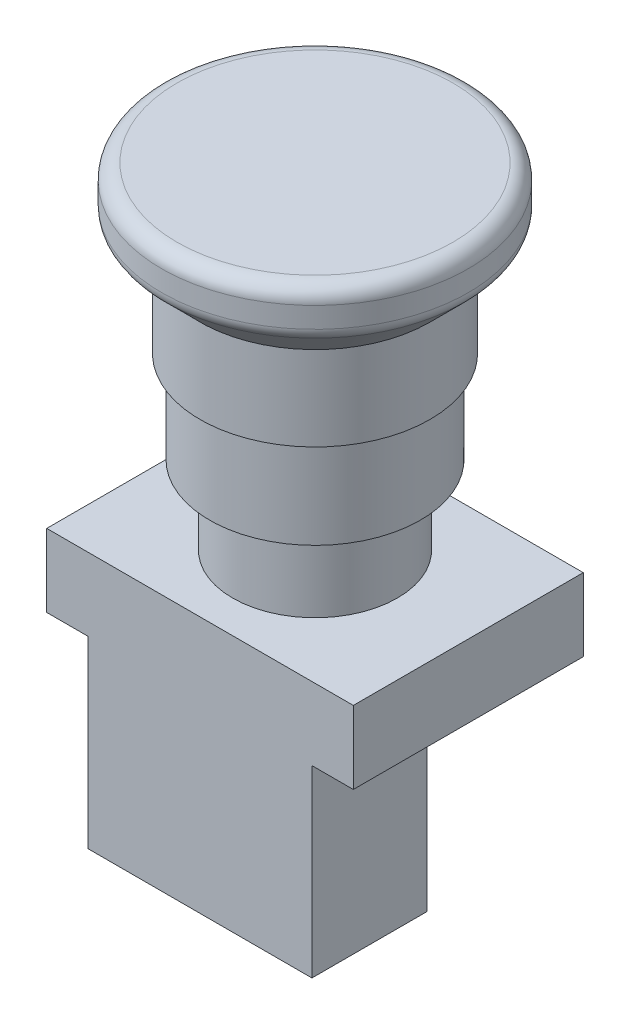
ISO-10303-21;
HEADER;
FILE_DESCRIPTION(('STEP AP214'),'2;1');
FILE_NAME('part.step','',(''),(''),'','','');
FILE_SCHEMA(('AUTOMOTIVE_DESIGN { 1 0 10303 214 1 1 1 1 }'));
ENDSEC;
DATA;
#1=APPLICATION_CONTEXT('core data for automotive mechanical design processes');
#2=APPLICATION_PROTOCOL_DEFINITION('international standard','automotive_design',2000,#1);
#3=PRODUCT_CONTEXT('',#1,'mechanical');
#4=PRODUCT('Part','Part','',(#3));
#5=PRODUCT_RELATED_PRODUCT_CATEGORY('part','',(#4));
#6=PRODUCT_DEFINITION_FORMATION('','',#4);
#7=PRODUCT_DEFINITION_CONTEXT('part definition',#1,'design');
#8=PRODUCT_DEFINITION('design','',#6,#7);
#9=PRODUCT_DEFINITION_SHAPE('','',#8);
#10=(LENGTH_UNIT() NAMED_UNIT(*) SI_UNIT(.MILLI.,.METRE.));
#11=(NAMED_UNIT(*) PLANE_ANGLE_UNIT() SI_UNIT($,.RADIAN.));
#12=(NAMED_UNIT(*) SI_UNIT($,.STERADIAN.) SOLID_ANGLE_UNIT());
#13=UNCERTAINTY_MEASURE_WITH_UNIT(LENGTH_MEASURE(1.E-05),#10,'distance_accuracy_value','');
#14=(GEOMETRIC_REPRESENTATION_CONTEXT(3) GLOBAL_UNCERTAINTY_ASSIGNED_CONTEXT((#13)) GLOBAL_UNIT_ASSIGNED_CONTEXT((#10,
#11,#12)) REPRESENTATION_CONTEXT('',''));
#15=CARTESIAN_POINT('',(0.,0.,0.));
#16=DIRECTION('',(0.,0.,1.));
#17=DIRECTION('',(1.,0.,0.));
#18=AXIS2_PLACEMENT_3D('',#15,#16,#17);
#19=CARTESIAN_POINT('',(0.,0.,0.));
#20=DIRECTION('',(0.,-1.,0.));
#21=DIRECTION('',(0.,0.,-1.));
#22=AXIS2_PLACEMENT_3D('',#19,#20,#21);
#23=CYLINDRICAL_SURFACE('',#22,13.75);
#24=CARTESIAN_POINT('',(0.,12.,0.));
#25=DIRECTION('',(0.,-1.,0.));
#26=DIRECTION('',(0.,0.,-1.));
#27=AXIS2_PLACEMENT_3D('',#24,#25,#26);
#28=CIRCLE('',#27,13.75);
#29=CARTESIAN_POINT('',(0.,12.,-13.75));
#30=VERTEX_POINT('',#29);
#31=EDGE_CURVE('E218',#30,#30,#28,.T.);
#32=ORIENTED_EDGE('',*,*,#31,.T.);
#33=EDGE_LOOP('',(#32));
#34=FACE_BOUND('',#33,.T.);
#35=CARTESIAN_POINT('',(0.,0.,0.));
#36=DIRECTION('',(0.,-1.,0.));
#37=DIRECTION('',(0.,0.,-1.));
#38=AXIS2_PLACEMENT_3D('',#35,#36,#37);
#39=CIRCLE('',#38,13.75);
#40=CARTESIAN_POINT('',(0.,0.,-13.75));
#41=VERTEX_POINT('',#40);
#42=EDGE_CURVE('E55',#41,#41,#39,.T.);
#43=ORIENTED_EDGE('',*,*,#42,.F.);
#44=EDGE_LOOP('',(#43));
#45=FACE_BOUND('',#44,.T.);
#46=ADVANCED_FACE('F51',(#34,#45),#23,.T.);
#47=CARTESIAN_POINT('',(0.,0.,0.));
#48=DIRECTION('',(0.,-1.,0.));
#49=DIRECTION('',(0.,0.,-1.));
#50=AXIS2_PLACEMENT_3D('',#47,#48,#49);
#51=PLANE('',#50);
#52=CARTESIAN_POINT('',(0.,0.,0.));
#53=DIRECTION('',(0.,-1.,0.));
#54=DIRECTION('',(0.,0.,-1.));
#55=AXIS2_PLACEMENT_3D('',#52,#53,#54);
#56=CIRCLE('',#55,10.75);
#57=CARTESIAN_POINT('',(0.,0.,10.75));
#58=VERTEX_POINT('',#57);
#59=EDGE_CURVE('E11',#58,#58,#56,.T.);
#60=ORIENTED_EDGE('',*,*,#59,.F.);
#61=EDGE_LOOP('',(#60));
#62=FACE_BOUND('',#61,.T.);
#63=ORIENTED_EDGE('',*,*,#42,.T.);
#64=EDGE_LOOP('',(#63));
#65=FACE_BOUND('',#64,.T.);
#66=ADVANCED_FACE('F53',(#62,#65),#51,.T.);
#67=CARTESIAN_POINT('',(0.,12.,0.));
#68=DIRECTION('',(0.,1.,0.));
#69=DIRECTION('',(-1.,0.,0.));
#70=AXIS2_PLACEMENT_3D('',#67,#68,#69);
#71=PLANE('',#70);
#72=ORIENTED_EDGE('',*,*,#31,.F.);
#73=EDGE_LOOP('',(#72));
#74=FACE_BOUND('',#73,.T.);
#75=CARTESIAN_POINT('',(0.,12.,0.));
#76=DIRECTION('',(0.,1.,0.));
#77=DIRECTION('',(-1.,0.,0.));
#78=AXIS2_PLACEMENT_3D('',#75,#76,#77);
#79=CIRCLE('',#78,15.);
#80=CARTESIAN_POINT('',(-15.,12.,0.));
#81=VERTEX_POINT('',#80);
#82=EDGE_CURVE('E215',#81,#81,#79,.T.);
#83=ORIENTED_EDGE('',*,*,#82,.F.);
#84=EDGE_LOOP('',(#83));
#85=FACE_BOUND('',#84,.T.);
#86=ADVANCED_FACE('F229',(#74,#85),#71,.F.);
#87=CARTESIAN_POINT('',(0.,28.,0.));
#88=DIRECTION('',(0.,1.,0.));
#89=DIRECTION('',(-1.,0.,0.));
#90=AXIS2_PLACEMENT_3D('',#87,#88,#89);
#91=CYLINDRICAL_SURFACE('',#90,15.);
#92=CARTESIAN_POINT('',(0.,23.,0.));
#93=DIRECTION('',(0.,1.,0.));
#94=DIRECTION('',(-1.,0.,0.));
#95=AXIS2_PLACEMENT_3D('',#92,#93,#94);
#96=CIRCLE('',#95,15.);
#97=CARTESIAN_POINT('',(-15.,23.,0.));
#98=VERTEX_POINT('',#97);
#99=EDGE_CURVE('E211',#98,#98,#96,.T.);
#100=ORIENTED_EDGE('',*,*,#99,.F.);
#101=EDGE_LOOP('',(#100));
#102=FACE_BOUND('',#101,.T.);
#103=ORIENTED_EDGE('',*,*,#82,.T.);
#104=EDGE_LOOP('',(#103));
#105=FACE_BOUND('',#104,.T.);
#106=ADVANCED_FACE('F237',(#102,#105),#91,.T.);
#107=CARTESIAN_POINT('',(0.,23.,0.));
#108=DIRECTION('',(0.,1.,0.));
#109=DIRECTION('',(-1.,0.,0.));
#110=AXIS2_PLACEMENT_3D('',#107,#108,#109);
#111=CONICAL_SURFACE('',#110,15.,0.785398163397448);
#112=CARTESIAN_POINT('',(0.,27.4142135623731,0.));
#113=DIRECTION('',(0.,1.,0.));
#114=DIRECTION('',(-1.,0.,0.));
#115=AXIS2_PLACEMENT_3D('',#112,#113,#114);
#116=CIRCLE('',#115,19.4142135623731);
#117=CARTESIAN_POINT('',(-19.4142135623731,27.4142135623731,0.));
#118=VERTEX_POINT('',#117);
#119=EDGE_CURVE('E207',#118,#118,#116,.T.);
#120=ORIENTED_EDGE('',*,*,#119,.F.);
#121=EDGE_LOOP('',(#120));
#122=FACE_BOUND('',#121,.T.);
#123=ORIENTED_EDGE('',*,*,#99,.T.);
#124=EDGE_LOOP('',(#123));
#125=FACE_BOUND('',#124,.T.);
#126=ADVANCED_FACE('F242',(#122,#125),#111,.T.);
#127=CARTESIAN_POINT('',(0.,28.8284271247462,0.));
#128=DIRECTION('',(0.,1.,0.));
#129=DIRECTION('',(-1.,0.,0.));
#130=AXIS2_PLACEMENT_3D('',#127,#128,#129);
#131=TOROIDAL_SURFACE('',#130,18.,2.);
#132=CARTESIAN_POINT('',(0.,28.8284271247462,0.));
#133=DIRECTION('',(0.,1.,0.));
#134=DIRECTION('',(-1.,0.,0.));
#135=AXIS2_PLACEMENT_3D('',#132,#133,#134);
#136=CIRCLE('',#135,20.);
#137=CARTESIAN_POINT('',(-20.,28.8284271247462,0.));
#138=VERTEX_POINT('',#137);
#139=EDGE_CURVE('E203',#138,#138,#136,.T.);
#140=ORIENTED_EDGE('',*,*,#139,.F.);
#141=EDGE_LOOP('',(#140));
#142=FACE_BOUND('',#141,.T.);
#143=ORIENTED_EDGE('',*,*,#119,.T.);
#144=EDGE_LOOP('',(#143));
#145=FACE_BOUND('',#144,.T.);
#146=ADVANCED_FACE('F249',(#142,#145),#131,.T.);
#147=CARTESIAN_POINT('',(0.,28.,0.));
#148=DIRECTION('',(0.,1.,0.));
#149=DIRECTION('',(-1.,0.,0.));
#150=AXIS2_PLACEMENT_3D('',#147,#148,#149);
#151=CYLINDRICAL_SURFACE('',#150,20.);
#152=CARTESIAN_POINT('',(0.,31.5281435790811,0.));
#153=DIRECTION('',(0.,1.,0.));
#154=DIRECTION('',(-1.,0.,0.));
#155=AXIS2_PLACEMENT_3D('',#152,#153,#154);
#156=CIRCLE('',#155,20.);
#157=CARTESIAN_POINT('',(-20.,31.5281435790811,0.));
#158=VERTEX_POINT('',#157);
#159=EDGE_CURVE('E199',#158,#158,#156,.T.);
#160=ORIENTED_EDGE('',*,*,#159,.F.);
#161=EDGE_LOOP('',(#160));
#162=FACE_BOUND('',#161,.T.);
#163=ORIENTED_EDGE('',*,*,#139,.T.);
#164=EDGE_LOOP('',(#163));
#165=FACE_BOUND('',#164,.T.);
#166=ADVANCED_FACE('F253',(#162,#165),#151,.T.);
#167=CARTESIAN_POINT('',(0.,31.5281435790811,0.));
#168=DIRECTION('',(0.,1.,0.));
#169=DIRECTION('',(-1.,0.,0.));
#170=AXIS2_PLACEMENT_3D('',#167,#168,#169);
#171=TOROIDAL_SURFACE('',#170,18.,2.);
#172=CARTESIAN_POINT('',(0.,33.5281435790811,0.));
#173=DIRECTION('',(0.,1.,0.));
#174=DIRECTION('',(-1.,0.,0.));
#175=AXIS2_PLACEMENT_3D('',#172,#173,#174);
#176=CIRCLE('',#175,18.);
#177=CARTESIAN_POINT('',(-18.,33.5281435790811,0.));
#178=VERTEX_POINT('',#177);
#179=EDGE_CURVE('E194',#178,#178,#176,.T.);
#180=ORIENTED_EDGE('',*,*,#179,.F.);
#181=EDGE_LOOP('',(#180));
#182=FACE_BOUND('',#181,.T.);
#183=ORIENTED_EDGE('',*,*,#159,.T.);
#184=EDGE_LOOP('',(#183));
#185=FACE_BOUND('',#184,.T.);
#186=ADVANCED_FACE('F257',(#182,#185),#171,.T.);
#187=CARTESIAN_POINT('',(0.,33.5281435790811,0.));
#188=DIRECTION('',(0.,-1.,0.));
#189=DIRECTION('',(1.,0.,0.));
#190=AXIS2_PLACEMENT_3D('',#187,#188,#189);
#191=PLANE('',#190);
#192=ORIENTED_EDGE('',*,*,#179,.T.);
#193=EDGE_LOOP('',(#192));
#194=FACE_BOUND('',#193,.T.);
#195=ADVANCED_FACE('F261',(#194),#191,.F.);
#196=CARTESIAN_POINT('',(0.,-10.3,0.));
#197=DIRECTION('',(0.,1.,0.));
#198=DIRECTION('',(0.,0.,1.));
#199=AXIS2_PLACEMENT_3D('',#196,#197,#198);
#200=CYLINDRICAL_SURFACE('',#199,10.75);
#201=CARTESIAN_POINT('',(0.,-10.3,0.));
#202=DIRECTION('',(0.,-1.,0.));
#203=DIRECTION('',(0.,0.,-1.));
#204=AXIS2_PLACEMENT_3D('',#201,#202,#203);
#205=CIRCLE('',#204,10.75);
#206=CARTESIAN_POINT('',(0.,-10.3,10.75));
#207=VERTEX_POINT('',#206);
#208=EDGE_CURVE('E191',#207,#207,#205,.T.);
#209=CARTESIAN_POINT('',(0.,-10.3,10.75));
#210=CARTESIAN_POINT('',(0.,-10.1927083333333,10.75));
#211=CARTESIAN_POINT('',(0.,-10.0854166666667,10.75));
#212=CARTESIAN_POINT('',(0.,-9.87083333333333,10.75));
#213=CARTESIAN_POINT('',(0.,-9.76354166666667,10.75));
#214=CARTESIAN_POINT('',(0.,-9.54895833333333,10.75));
#215=CARTESIAN_POINT('',(0.,-9.44166666666667,10.75));
#216=CARTESIAN_POINT('',(0.,-9.22708333333333,10.75));
#217=CARTESIAN_POINT('',(0.,-9.11979166666667,10.75));
#218=CARTESIAN_POINT('',(0.,-8.90520833333333,10.75));
#219=CARTESIAN_POINT('',(0.,-8.79791666666667,10.75));
#220=CARTESIAN_POINT('',(0.,-8.58333333333333,10.75));
#221=CARTESIAN_POINT('',(0.,-8.47604166666667,10.75));
#222=CARTESIAN_POINT('',(0.,-8.26145833333333,10.75));
#223=CARTESIAN_POINT('',(0.,-8.15416666666667,10.75));
#224=CARTESIAN_POINT('',(0.,-7.93958333333333,10.75));
#225=CARTESIAN_POINT('',(0.,-7.83229166666667,10.75));
#226=CARTESIAN_POINT('',(0.,-7.61770833333333,10.75));
#227=CARTESIAN_POINT('',(0.,-7.51041666666667,10.75));
#228=CARTESIAN_POINT('',(0.,-7.29583333333333,10.75));
#229=CARTESIAN_POINT('',(0.,-7.18854166666666,10.75));
#230=CARTESIAN_POINT('',(0.,-6.97395833333333,10.75));
#231=CARTESIAN_POINT('',(0.,-6.86666666666667,10.75));
#232=CARTESIAN_POINT('',(0.,-6.65208333333333,10.75));
#233=CARTESIAN_POINT('',(0.,-6.54479166666667,10.75));
#234=CARTESIAN_POINT('',(0.,-6.33020833333333,10.75));
#235=CARTESIAN_POINT('',(0.,-6.22291666666667,10.75));
#236=CARTESIAN_POINT('',(0.,-6.00833333333333,10.75));
#237=CARTESIAN_POINT('',(0.,-5.90104166666667,10.75));
#238=CARTESIAN_POINT('',(0.,-5.68645833333333,10.75));
#239=CARTESIAN_POINT('',(0.,-5.57916666666667,10.75));
#240=CARTESIAN_POINT('',(0.,-5.36458333333333,10.75));
#241=CARTESIAN_POINT('',(0.,-5.25729166666667,10.75));
#242=CARTESIAN_POINT('',(0.,-5.04270833333333,10.75));
#243=CARTESIAN_POINT('',(0.,-4.93541666666667,10.75));
#244=CARTESIAN_POINT('',(0.,-4.72083333333333,10.75));
#245=CARTESIAN_POINT('',(0.,-4.61354166666666,10.75));
#246=CARTESIAN_POINT('',(0.,-4.39895833333333,10.75));
#247=CARTESIAN_POINT('',(0.,-4.29166666666667,10.75));
#248=CARTESIAN_POINT('',(0.,-4.07708333333333,10.75));
#249=CARTESIAN_POINT('',(0.,-3.96979166666666,10.75));
#250=CARTESIAN_POINT('',(0.,-3.75520833333333,10.75));
#251=CARTESIAN_POINT('',(0.,-3.64791666666666,10.75));
#252=CARTESIAN_POINT('',(0.,-3.43333333333333,10.75));
#253=CARTESIAN_POINT('',(0.,-3.32604166666666,10.75));
#254=CARTESIAN_POINT('',(0.,-3.11145833333333,10.75));
#255=CARTESIAN_POINT('',(0.,-3.00416666666666,10.75));
#256=CARTESIAN_POINT('',(0.,-2.78958333333333,10.75));
#257=CARTESIAN_POINT('',(0.,-2.68229166666666,10.75));
#258=CARTESIAN_POINT('',(0.,-2.46770833333333,10.75));
#259=CARTESIAN_POINT('',(0.,-2.36041666666667,10.75));
#260=CARTESIAN_POINT('',(0.,-2.14583333333333,10.75));
#261=CARTESIAN_POINT('',(0.,-2.03854166666667,10.75));
#262=CARTESIAN_POINT('',(0.,-1.82395833333333,10.75));
#263=CARTESIAN_POINT('',(0.,-1.71666666666667,10.75));
#264=CARTESIAN_POINT('',(0.,-1.50208333333333,10.75));
#265=CARTESIAN_POINT('',(0.,-1.39479166666667,10.75));
#266=CARTESIAN_POINT('',(0.,-1.18020833333333,10.75));
#267=CARTESIAN_POINT('',(0.,-1.07291666666667,10.75));
#268=CARTESIAN_POINT('',(0.,-0.858333333333333,10.75));
#269=CARTESIAN_POINT('',(0.,-0.751041666666665,10.75));
#270=CARTESIAN_POINT('',(0.,-0.536458333333331,10.75));
#271=CARTESIAN_POINT('',(0.,-0.429166666666664,10.75));
#272=CARTESIAN_POINT('',(0.,-0.214583333333331,10.75));
#273=CARTESIAN_POINT('',(0.,-0.107291666666665,10.75));
#274=CARTESIAN_POINT('',(0.,0.,10.75));
#275=B_SPLINE_CURVE_WITH_KNOTS('',3,(#209,#210,#211,#212,#213,#214,#215,#216,#217,#218,#219,
#220,#221,#222,#223,#224,#225,#226,#227,#228,#229,#230,#231,#232,#233,#234,#235,#236,#237,#238,
#239,#240,#241,#242,#243,#244,#245,#246,#247,#248,#249,#250,#251,#252,#253,#254,#255,#256,#257,
#258,#259,#260,#261,#262,#263,#264,#265,#266,#267,#268,#269,#270,#271,#272,#273,#274),
.UNSPECIFIED.,.F.,.F.,(4,2,2,2,2,2,2,2,2,2,2,2,2,2,2,2,2,2,2,2,2,2,2,2,2,2,2,2,2,2,2,2,4),(0.,
0.321875000000001,0.64375,0.965625000000001,1.2875,1.609375,1.93125,2.253125,2.575,2.896875,
3.21875,3.540625,3.8625,4.184375,4.50625,4.828125,5.15,5.471875,5.79375,6.115625,6.4375,
6.759375,7.08125,7.403125,7.725,8.046875,8.36875,8.690625,9.0125,9.334375,9.65625,9.978125,
10.3),.UNSPECIFIED.);
#276=EDGE_CURVE('BSEAM265',#207,#58,#275,.T.);
#277=ORIENTED_EDGE('',*,*,#208,.F.);
#278=ORIENTED_EDGE('',*,*,#59,.T.);
#279=ORIENTED_EDGE('',*,*,#276,.T.);
#280=ORIENTED_EDGE('',*,*,#276,.F.);
#281=EDGE_LOOP('',(#277,#279,#278,#280));
#282=FACE_BOUND('',#281,.T.);
#283=ADVANCED_FACE('F265',(#282),#200,.T.);
#284=CARTESIAN_POINT('',(20.,-19.8,15.));
#285=DIRECTION('',(-1.,0.,0.));
#286=DIRECTION('',(0.,0.,1.));
#287=AXIS2_PLACEMENT_3D('',#284,#285,#286);
#288=PLANE('',#287);
#289=DIRECTION('',(0.,0.,1.));
#290=VECTOR('',#289,1.);
#291=CARTESIAN_POINT('',(20.,-10.3,15.));
#292=LINE('',#291,#290);
#293=CARTESIAN_POINT('',(20.,-10.3,-15.));
#294=VERTEX_POINT('',#293);
#295=CARTESIAN_POINT('',(20.,-10.3,15.));
#296=VERTEX_POINT('',#295);
#297=EDGE_CURVE('E142',#294,#296,#292,.T.);
#298=ORIENTED_EDGE('',*,*,#297,.T.);
#299=DIRECTION('',(0.,1.,0.));
#300=VECTOR('',#299,1.);
#301=CARTESIAN_POINT('',(20.,-19.8,15.));
#302=LINE('',#301,#300);
#303=CARTESIAN_POINT('',(20.,-19.8,15.));
#304=VERTEX_POINT('',#303);
#305=EDGE_CURVE('E187',#304,#296,#302,.T.);
#306=ORIENTED_EDGE('',*,*,#305,.F.);
#307=DIRECTION('',(0.,0.,1.));
#308=VECTOR('',#307,1.);
#309=CARTESIAN_POINT('',(20.,-19.8,15.));
#310=LINE('',#309,#308);
#311=CARTESIAN_POINT('',(20.,-19.8,-15.));
#312=VERTEX_POINT('',#311);
#313=EDGE_CURVE('E153',#312,#304,#310,.T.);
#314=ORIENTED_EDGE('',*,*,#313,.F.);
#315=DIRECTION('',(0.,1.,0.));
#316=VECTOR('',#315,1.);
#317=CARTESIAN_POINT('',(20.,-19.8,-15.));
#318=LINE('',#317,#316);
#319=EDGE_CURVE('E167',#312,#294,#318,.T.);
#320=ORIENTED_EDGE('',*,*,#319,.T.);
#321=EDGE_LOOP('',(#298,#306,#314,#320));
#322=FACE_BOUND('',#321,.T.);
#323=ADVANCED_FACE('F269',(#322),#288,.F.);
#324=CARTESIAN_POINT('',(-20.,-19.8,15.));
#325=DIRECTION('',(0.,0.,-1.));
#326=DIRECTION('',(-1.,0.,0.));
#327=AXIS2_PLACEMENT_3D('',#324,#325,#326);
#328=PLANE('',#327);
#329=DIRECTION('',(-1.,0.,0.));
#330=VECTOR('',#329,1.);
#331=CARTESIAN_POINT('',(-20.,-10.3,15.));
#332=LINE('',#331,#330);
#333=CARTESIAN_POINT('',(-20.,-10.3,15.));
#334=VERTEX_POINT('',#333);
#335=EDGE_CURVE('E147',#296,#334,#332,.T.);
#336=ORIENTED_EDGE('',*,*,#335,.T.);
#337=DIRECTION('',(0.,1.,0.));
#338=VECTOR('',#337,1.);
#339=CARTESIAN_POINT('',(-20.,-19.8,15.));
#340=LINE('',#339,#338);
#341=CARTESIAN_POINT('',(-20.,-19.8,15.));
#342=VERTEX_POINT('',#341);
#343=EDGE_CURVE('E183',#342,#334,#340,.T.);
#344=ORIENTED_EDGE('',*,*,#343,.F.);
#345=DIRECTION('',(-1.,0.,0.));
#346=VECTOR('',#345,1.);
#347=CARTESIAN_POINT('',(-20.,-19.8,15.));
#348=LINE('',#347,#346);
#349=CARTESIAN_POINT('',(-14.6,-19.8,15.));
#350=VERTEX_POINT('',#349);
#351=EDGE_CURVE('E157',#350,#342,#348,.T.);
#352=ORIENTED_EDGE('',*,*,#351,.F.);
#353=DIRECTION('',(0.,1.,0.));
#354=VECTOR('',#353,1.);
#355=CARTESIAN_POINT('',(-14.6,-43.8,15.));
#356=LINE('',#355,#354);
#357=CARTESIAN_POINT('',(-14.6,-43.8,15.));
#358=VERTEX_POINT('',#357);
#359=EDGE_CURVE('E123',#358,#350,#356,.T.);
#360=ORIENTED_EDGE('',*,*,#359,.F.);
#361=DIRECTION('',(-1.,0.,0.));
#362=VECTOR('',#361,1.);
#363=CARTESIAN_POINT('',(-14.6,-43.8,15.));
#364=LINE('',#363,#362);
#365=CARTESIAN_POINT('',(14.6,-43.8,15.));
#366=VERTEX_POINT('',#365);
#367=EDGE_CURVE('E117',#366,#358,#364,.T.);
#368=ORIENTED_EDGE('',*,*,#367,.F.);
#369=DIRECTION('',(0.,1.,0.));
#370=VECTOR('',#369,1.);
#371=CARTESIAN_POINT('',(14.6,-43.8,15.));
#372=LINE('',#371,#370);
#373=CARTESIAN_POINT('',(14.6,-19.8,15.));
#374=VERTEX_POINT('',#373);
#375=EDGE_CURVE('E121',#366,#374,#372,.T.);
#376=ORIENTED_EDGE('',*,*,#375,.T.);
#377=EDGE_CURVE('E159',#304,#374,#348,.T.);
#378=ORIENTED_EDGE('',*,*,#377,.F.);
#379=ORIENTED_EDGE('',*,*,#305,.T.);
#380=EDGE_LOOP('',(#336,#344,#352,#360,#368,#376,#378,#379));
#381=FACE_BOUND('',#380,.T.);
#382=ADVANCED_FACE('F119',(#381),#328,.F.);
#383=CARTESIAN_POINT('',(-20.,-19.8,15.));
#384=DIRECTION('',(1.,0.,0.));
#385=DIRECTION('',(0.,0.,-1.));
#386=AXIS2_PLACEMENT_3D('',#383,#384,#385);
#387=PLANE('',#386);
#388=DIRECTION('',(0.,0.,-1.));
#389=VECTOR('',#388,1.);
#390=CARTESIAN_POINT('',(-20.,-10.3,15.));
#391=LINE('',#390,#389);
#392=CARTESIAN_POINT('',(-20.,-10.3,-15.));
#393=VERTEX_POINT('',#392);
#394=EDGE_CURVE('E171',#334,#393,#391,.T.);
#395=ORIENTED_EDGE('',*,*,#394,.T.);
#396=DIRECTION('',(0.,1.,0.));
#397=VECTOR('',#396,1.);
#398=CARTESIAN_POINT('',(-20.,-19.8,-15.));
#399=LINE('',#398,#397);
#400=CARTESIAN_POINT('',(-20.,-19.8,-15.));
#401=VERTEX_POINT('',#400);
#402=EDGE_CURVE('E179',#401,#393,#399,.T.);
#403=ORIENTED_EDGE('',*,*,#402,.F.);
#404=DIRECTION('',(0.,0.,-1.));
#405=VECTOR('',#404,1.);
#406=CARTESIAN_POINT('',(-20.,-19.8,15.));
#407=LINE('',#406,#405);
#408=EDGE_CURVE('E162',#342,#401,#407,.T.);
#409=ORIENTED_EDGE('',*,*,#408,.F.);
#410=ORIENTED_EDGE('',*,*,#343,.T.);
#411=EDGE_LOOP('',(#395,#403,#409,#410));
#412=FACE_BOUND('',#411,.T.);
#413=ADVANCED_FACE('F276',(#412),#387,.F.);
#414=CARTESIAN_POINT('',(-20.,-19.8,-15.));
#415=DIRECTION('',(0.,0.,1.));
#416=DIRECTION('',(1.,0.,0.));
#417=AXIS2_PLACEMENT_3D('',#414,#415,#416);
#418=PLANE('',#417);
#419=DIRECTION('',(1.,0.,0.));
#420=VECTOR('',#419,1.);
#421=CARTESIAN_POINT('',(-20.,-10.3,-15.));
#422=LINE('',#421,#420);
#423=EDGE_CURVE('E158',#393,#294,#422,.T.);
#424=ORIENTED_EDGE('',*,*,#423,.T.);
#425=ORIENTED_EDGE('',*,*,#319,.F.);
#426=DIRECTION('',(1.,0.,0.));
#427=VECTOR('',#426,1.);
#428=CARTESIAN_POINT('',(-20.,-19.8,-15.));
#429=LINE('',#428,#427);
#430=EDGE_CURVE('E165',#401,#312,#429,.T.);
#431=ORIENTED_EDGE('',*,*,#430,.F.);
#432=ORIENTED_EDGE('',*,*,#402,.T.);
#433=EDGE_LOOP('',(#424,#425,#431,#432));
#434=FACE_BOUND('',#433,.T.);
#435=ADVANCED_FACE('F279',(#434),#418,.F.);
#436=CARTESIAN_POINT('',(0.,-19.8,0.));
#437=DIRECTION('',(0.,-1.,0.));
#438=DIRECTION('',(0.,0.,-1.));
#439=AXIS2_PLACEMENT_3D('',#436,#437,#438);
#440=PLANE('',#439);
#441=DIRECTION('',(0.,0.,1.));
#442=VECTOR('',#441,1.);
#443=CARTESIAN_POINT('',(14.6,-19.8,15.));
#444=LINE('',#443,#442);
#445=CARTESIAN_POINT('',(14.6,-19.8,0.));
#446=VERTEX_POINT('',#445);
#447=EDGE_CURVE('E68',#446,#374,#444,.T.);
#448=ORIENTED_EDGE('',*,*,#447,.F.);
#449=DIRECTION('',(1.,0.,0.));
#450=VECTOR('',#449,1.);
#451=CARTESIAN_POINT('',(-14.6,-19.8,0.));
#452=LINE('',#451,#450);
#453=CARTESIAN_POINT('',(-14.6,-19.8,0.));
#454=VERTEX_POINT('',#453);
#455=EDGE_CURVE('E138',#454,#446,#452,.T.);
#456=ORIENTED_EDGE('',*,*,#455,.F.);
#457=DIRECTION('',(0.,0.,-1.));
#458=VECTOR('',#457,1.);
#459=CARTESIAN_POINT('',(-14.6,-19.8,15.));
#460=LINE('',#459,#458);
#461=EDGE_CURVE('E74',#350,#454,#460,.T.);
#462=ORIENTED_EDGE('',*,*,#461,.F.);
#463=ORIENTED_EDGE('',*,*,#351,.T.);
#464=ORIENTED_EDGE('',*,*,#408,.T.);
#465=ORIENTED_EDGE('',*,*,#430,.T.);
#466=ORIENTED_EDGE('',*,*,#313,.T.);
#467=ORIENTED_EDGE('',*,*,#377,.T.);
#468=EDGE_LOOP('',(#448,#456,#462,#463,#464,#465,#466,#467));
#469=FACE_BOUND('',#468,.T.);
#470=ADVANCED_FACE('F283',(#469),#440,.T.);
#471=CARTESIAN_POINT('',(0.,-10.3,0.));
#472=DIRECTION('',(0.,-1.,0.));
#473=DIRECTION('',(0.,0.,-1.));
#474=AXIS2_PLACEMENT_3D('',#471,#472,#473);
#475=PLANE('',#474);
#476=ORIENTED_EDGE('',*,*,#208,.T.);
#477=EDGE_LOOP('',(#476));
#478=FACE_BOUND('',#477,.T.);
#479=ORIENTED_EDGE('',*,*,#297,.F.);
#480=ORIENTED_EDGE('',*,*,#423,.F.);
#481=ORIENTED_EDGE('',*,*,#394,.F.);
#482=ORIENTED_EDGE('',*,*,#335,.F.);
#483=EDGE_LOOP('',(#479,#480,#481,#482));
#484=FACE_BOUND('',#483,.T.);
#485=ADVANCED_FACE('F285',(#478,#484),#475,.F.);
#486=CARTESIAN_POINT('',(14.6,-43.8,15.));
#487=DIRECTION('',(-1.,0.,0.));
#488=DIRECTION('',(0.,0.,1.));
#489=AXIS2_PLACEMENT_3D('',#486,#487,#488);
#490=PLANE('',#489);
#491=ORIENTED_EDGE('',*,*,#447,.T.);
#492=ORIENTED_EDGE('',*,*,#375,.F.);
#493=DIRECTION('',(0.,0.,1.));
#494=VECTOR('',#493,1.);
#495=CARTESIAN_POINT('',(14.6,-43.8,15.));
#496=LINE('',#495,#494);
#497=CARTESIAN_POINT('',(14.6,-43.8,0.));
#498=VERTEX_POINT('',#497);
#499=EDGE_CURVE('E128',#498,#366,#496,.T.);
#500=ORIENTED_EDGE('',*,*,#499,.F.);
#501=DIRECTION('',(0.,1.,0.));
#502=VECTOR('',#501,1.);
#503=CARTESIAN_POINT('',(14.6,-43.8,0.));
#504=LINE('',#503,#502);
#505=EDGE_CURVE('E455',#498,#446,#504,.T.);
#506=ORIENTED_EDGE('',*,*,#505,.T.);
#507=EDGE_LOOP('',(#491,#492,#500,#506));
#508=FACE_BOUND('',#507,.T.);
#509=ADVANCED_FACE('F140',(#508),#490,.F.);
#510=CARTESIAN_POINT('',(-14.6,-43.8,15.));
#511=DIRECTION('',(1.,0.,0.));
#512=DIRECTION('',(0.,0.,-1.));
#513=AXIS2_PLACEMENT_3D('',#510,#511,#512);
#514=PLANE('',#513);
#515=ORIENTED_EDGE('',*,*,#461,.T.);
#516=DIRECTION('',(0.,1.,0.));
#517=VECTOR('',#516,1.);
#518=CARTESIAN_POINT('',(-14.6,-43.8,0.));
#519=LINE('',#518,#517);
#520=CARTESIAN_POINT('',(-14.6,-43.8,0.));
#521=VERTEX_POINT('',#520);
#522=EDGE_CURVE('E149',#521,#454,#519,.T.);
#523=ORIENTED_EDGE('',*,*,#522,.F.);
#524=DIRECTION('',(0.,0.,-1.));
#525=VECTOR('',#524,1.);
#526=CARTESIAN_POINT('',(-14.6,-43.8,15.));
#527=LINE('',#526,#525);
#528=EDGE_CURVE('E127',#358,#521,#527,.T.);
#529=ORIENTED_EDGE('',*,*,#528,.F.);
#530=ORIENTED_EDGE('',*,*,#359,.T.);
#531=EDGE_LOOP('',(#515,#523,#529,#530));
#532=FACE_BOUND('',#531,.T.);
#533=ADVANCED_FACE('F293',(#532),#514,.F.);
#534=CARTESIAN_POINT('',(-14.6,-43.8,0.));
#535=DIRECTION('',(0.,0.,1.));
#536=DIRECTION('',(1.,0.,0.));
#537=AXIS2_PLACEMENT_3D('',#534,#535,#536);
#538=PLANE('',#537);
#539=ORIENTED_EDGE('',*,*,#455,.T.);
#540=ORIENTED_EDGE('',*,*,#505,.F.);
#541=DIRECTION('',(1.,0.,0.));
#542=VECTOR('',#541,1.);
#543=CARTESIAN_POINT('',(-14.6,-43.8,0.));
#544=LINE('',#543,#542);
#545=EDGE_CURVE('E133',#521,#498,#544,.T.);
#546=ORIENTED_EDGE('',*,*,#545,.F.);
#547=ORIENTED_EDGE('',*,*,#522,.T.);
#548=EDGE_LOOP('',(#539,#540,#546,#547));
#549=FACE_BOUND('',#548,.T.);
#550=ADVANCED_FACE('F296',(#549),#538,.F.);
#551=CARTESIAN_POINT('',(0.,-43.8,0.));
#552=DIRECTION('',(0.,-1.,0.));
#553=DIRECTION('',(0.,0.,-1.));
#554=AXIS2_PLACEMENT_3D('',#551,#552,#553);
#555=PLANE('',#554);
#556=ORIENTED_EDGE('',*,*,#499,.T.);
#557=ORIENTED_EDGE('',*,*,#367,.T.);
#558=ORIENTED_EDGE('',*,*,#528,.T.);
#559=ORIENTED_EDGE('',*,*,#545,.T.);
#560=EDGE_LOOP('',(#556,#557,#558,#559));
#561=FACE_BOUND('',#560,.T.);
#562=ADVANCED_FACE('F131',(#561),#555,.T.);
#563=CLOSED_SHELL('',(#46,#66,#86,#106,#126,#146,#166,#186,#195,#283,#323,#382,#413,#435,#470,
#485,#509,#533,#550,#562));
#564=MANIFOLD_SOLID_BREP('B2',#563);
#565=ADVANCED_BREP_SHAPE_REPRESENTATION('',(#18,#564),#14);
#566=SHAPE_DEFINITION_REPRESENTATION(#9,#565);
ENDSEC;
END-ISO-10303-21;
